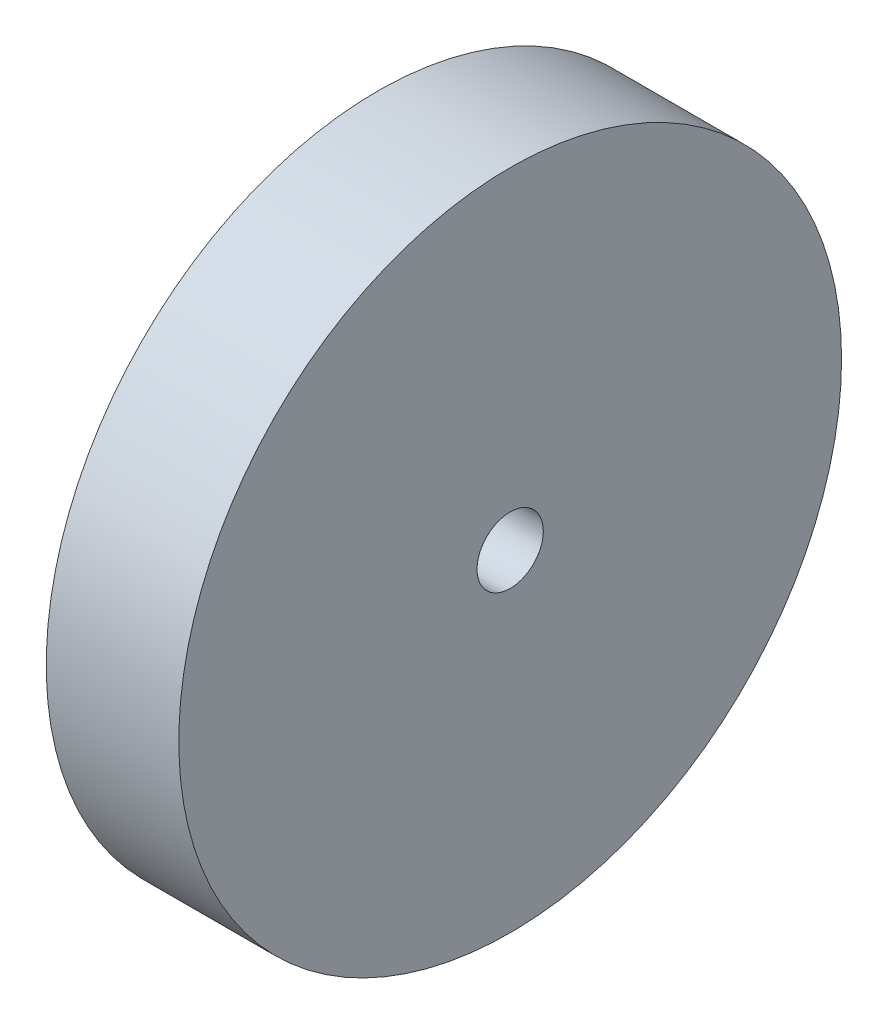
ISO-10303-21;
HEADER;
FILE_DESCRIPTION(('STEP AP214'),'2;1');
FILE_NAME('part.step','',(''),(''),'','','');
FILE_SCHEMA(('AUTOMOTIVE_DESIGN { 1 0 10303 214 1 1 1 1 }'));
ENDSEC;
DATA;
#1=APPLICATION_CONTEXT('core data for automotive mechanical design processes');
#2=APPLICATION_PROTOCOL_DEFINITION('international standard','automotive_design',2000,#1);
#3=PRODUCT_CONTEXT('',#1,'mechanical');
#4=PRODUCT('Part','Part','',(#3));
#5=PRODUCT_RELATED_PRODUCT_CATEGORY('part','',(#4));
#6=PRODUCT_DEFINITION_FORMATION('','',#4);
#7=PRODUCT_DEFINITION_CONTEXT('part definition',#1,'design');
#8=PRODUCT_DEFINITION('design','',#6,#7);
#9=PRODUCT_DEFINITION_SHAPE('','',#8);
#10=(LENGTH_UNIT() NAMED_UNIT(*) SI_UNIT(.MILLI.,.METRE.));
#11=(NAMED_UNIT(*) PLANE_ANGLE_UNIT() SI_UNIT($,.RADIAN.));
#12=(NAMED_UNIT(*) SI_UNIT($,.STERADIAN.) SOLID_ANGLE_UNIT());
#13=UNCERTAINTY_MEASURE_WITH_UNIT(LENGTH_MEASURE(1.E-05),#10,'distance_accuracy_value','');
#14=(GEOMETRIC_REPRESENTATION_CONTEXT(3) GLOBAL_UNCERTAINTY_ASSIGNED_CONTEXT((#13)) GLOBAL_UNIT_ASSIGNED_CONTEXT((#10,
#11,#12)) REPRESENTATION_CONTEXT('',''));
#15=CARTESIAN_POINT('',(0.,0.,0.));
#16=DIRECTION('',(0.,0.,1.));
#17=DIRECTION('',(1.,0.,0.));
#18=AXIS2_PLACEMENT_3D('',#15,#16,#17);
#19=CARTESIAN_POINT('',(20.,0.,0.));
#20=DIRECTION('',(1.,0.,0.));
#21=DIRECTION('',(0.,0.,-1.));
#22=AXIS2_PLACEMENT_3D('',#19,#20,#21);
#23=PLANE('',#22);
#24=CARTESIAN_POINT('',(20.,0.,0.));
#25=DIRECTION('',(1.,0.,0.));
#26=DIRECTION('',(0.,0.,-1.));
#27=AXIS2_PLACEMENT_3D('',#24,#25,#26);
#28=CIRCLE('',#27,50.);
#29=CARTESIAN_POINT('',(20.,0.,-50.));
#30=VERTEX_POINT('',#29);
#31=EDGE_CURVE('E10',#30,#30,#28,.T.);
#32=ORIENTED_EDGE('',*,*,#31,.T.);
#33=EDGE_LOOP('',(#32));
#34=FACE_BOUND('',#33,.T.);
#35=CARTESIAN_POINT('',(20.,0.,0.));
#36=DIRECTION('',(1.,0.,0.));
#37=DIRECTION('',(0.,0.,-1.));
#38=AXIS2_PLACEMENT_3D('',#35,#36,#37);
#39=CIRCLE('',#38,5.);
#40=CARTESIAN_POINT('',(20.,0.,-5.));
#41=VERTEX_POINT('',#40);
#42=EDGE_CURVE('E43',#41,#41,#39,.T.);
#43=ORIENTED_EDGE('',*,*,#42,.F.);
#44=EDGE_LOOP('',(#43));
#45=FACE_BOUND('',#44,.T.);
#46=ADVANCED_FACE('F32',(#34,#45),#23,.T.);
#47=CARTESIAN_POINT('',(0.,0.,0.));
#48=DIRECTION('',(1.,0.,0.));
#49=DIRECTION('',(0.,0.,-1.));
#50=AXIS2_PLACEMENT_3D('',#47,#48,#49);
#51=PLANE('',#50);
#52=CARTESIAN_POINT('',(0.,0.,0.));
#53=DIRECTION('',(1.,0.,0.));
#54=DIRECTION('',(0.,0.,-1.));
#55=AXIS2_PLACEMENT_3D('',#52,#53,#54);
#56=CIRCLE('',#55,50.);
#57=CARTESIAN_POINT('',(0.,0.,-50.));
#58=VERTEX_POINT('',#57);
#59=EDGE_CURVE('E36',#58,#58,#56,.T.);
#60=ORIENTED_EDGE('',*,*,#59,.F.);
#61=EDGE_LOOP('',(#60));
#62=FACE_BOUND('',#61,.T.);
#63=CARTESIAN_POINT('',(0.,0.,0.));
#64=DIRECTION('',(1.,0.,0.));
#65=DIRECTION('',(0.,0.,-1.));
#66=AXIS2_PLACEMENT_3D('',#63,#64,#65);
#67=CIRCLE('',#66,5.);
#68=CARTESIAN_POINT('',(0.,0.,-5.));
#69=VERTEX_POINT('',#68);
#70=EDGE_CURVE('E45',#69,#69,#67,.T.);
#71=ORIENTED_EDGE('',*,*,#70,.T.);
#72=EDGE_LOOP('',(#71));
#73=FACE_BOUND('',#72,.T.);
#74=ADVANCED_FACE('F55',(#62,#73),#51,.F.);
#75=CARTESIAN_POINT('',(20.,0.,0.));
#76=DIRECTION('',(-1.,0.,0.));
#77=DIRECTION('',(0.,0.,1.));
#78=AXIS2_PLACEMENT_3D('',#75,#76,#77);
#79=CYLINDRICAL_SURFACE('',#78,50.);
#80=ORIENTED_EDGE('',*,*,#31,.F.);
#81=EDGE_LOOP('',(#80));
#82=FACE_BOUND('',#81,.T.);
#83=ORIENTED_EDGE('',*,*,#59,.T.);
#84=EDGE_LOOP('',(#83));
#85=FACE_BOUND('',#84,.T.);
#86=ADVANCED_FACE('F34',(#82,#85),#79,.T.);
#87=CARTESIAN_POINT('',(20.,0.,0.));
#88=DIRECTION('',(-1.,0.,0.));
#89=DIRECTION('',(0.,0.,1.));
#90=AXIS2_PLACEMENT_3D('',#87,#88,#89);
#91=CYLINDRICAL_SURFACE('',#90,5.);
#92=ORIENTED_EDGE('',*,*,#42,.T.);
#93=EDGE_LOOP('',(#92));
#94=FACE_BOUND('',#93,.T.);
#95=ORIENTED_EDGE('',*,*,#70,.F.);
#96=EDGE_LOOP('',(#95));
#97=FACE_BOUND('',#96,.T.);
#98=ADVANCED_FACE('F51',(#94,#97),#91,.F.);
#99=CLOSED_SHELL('',(#46,#74,#86,#98));
#100=MANIFOLD_SOLID_BREP('B2',#99);
#101=ADVANCED_BREP_SHAPE_REPRESENTATION('',(#18,#100),#14);
#102=SHAPE_DEFINITION_REPRESENTATION(#9,#101);
ENDSEC;
END-ISO-10303-21;
